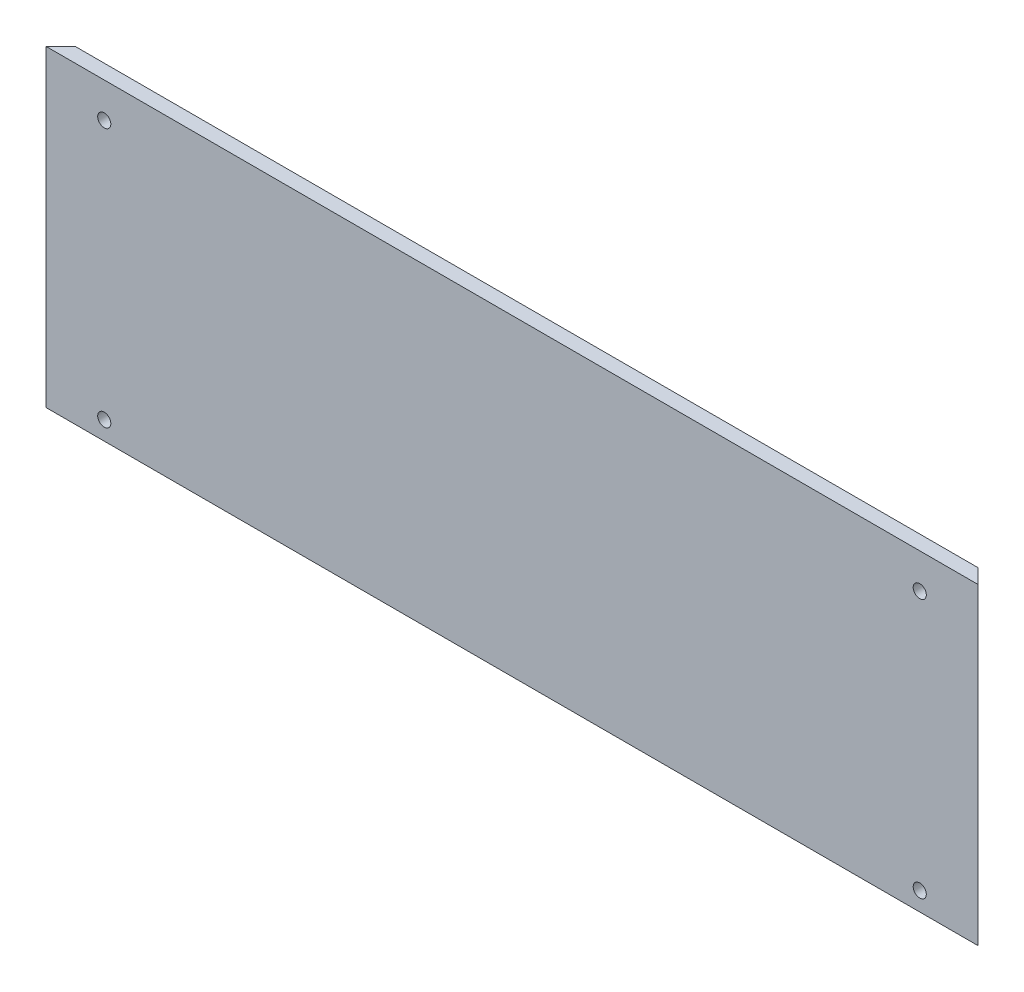
ISO-10303-21;
HEADER;
FILE_DESCRIPTION(('STEP AP214'),'2;1');
FILE_NAME('part.step','',(''),(''),'','','');
FILE_SCHEMA(('AUTOMOTIVE_DESIGN { 1 0 10303 214 1 1 1 1 }'));
ENDSEC;
DATA;
#1=APPLICATION_CONTEXT('core data for automotive mechanical design processes');
#2=APPLICATION_PROTOCOL_DEFINITION('international standard','automotive_design',2000,#1);
#3=PRODUCT_CONTEXT('',#1,'mechanical');
#4=PRODUCT('Part','Part','',(#3));
#5=PRODUCT_RELATED_PRODUCT_CATEGORY('part','',(#4));
#6=PRODUCT_DEFINITION_FORMATION('','',#4);
#7=PRODUCT_DEFINITION_CONTEXT('part definition',#1,'design');
#8=PRODUCT_DEFINITION('design','',#6,#7);
#9=PRODUCT_DEFINITION_SHAPE('','',#8);
#10=(LENGTH_UNIT() NAMED_UNIT(*) SI_UNIT(.MILLI.,.METRE.));
#11=(NAMED_UNIT(*) PLANE_ANGLE_UNIT() SI_UNIT($,.RADIAN.));
#12=(NAMED_UNIT(*) SI_UNIT($,.STERADIAN.) SOLID_ANGLE_UNIT());
#13=UNCERTAINTY_MEASURE_WITH_UNIT(LENGTH_MEASURE(1.E-05),#10,'distance_accuracy_value','');
#14=(GEOMETRIC_REPRESENTATION_CONTEXT(3) GLOBAL_UNCERTAINTY_ASSIGNED_CONTEXT((#13)) GLOBAL_UNIT_ASSIGNED_CONTEXT((#10,
#11,#12)) REPRESENTATION_CONTEXT('',''));
#15=CARTESIAN_POINT('',(0.,0.,0.));
#16=DIRECTION('',(0.,0.,1.));
#17=DIRECTION('',(1.,0.,0.));
#18=AXIS2_PLACEMENT_3D('',#15,#16,#17);
#19=CARTESIAN_POINT('',(0.,110.,-5.));
#20=DIRECTION('',(0.,1.,0.));
#21=DIRECTION('',(0.,0.,1.));
#22=AXIS2_PLACEMENT_3D('',#19,#20,#21);
#23=PLANE('',#22);
#24=DIRECTION('',(-0.707106781186544,0.,-0.707106781186551));
#25=VECTOR('',#24,1.);
#26=CARTESIAN_POINT('',(157.500000000002,110.,-162.5));
#27=LINE('',#26,#25);
#28=CARTESIAN_POINT('',(320.,110.,0.));
#29=VERTEX_POINT('',#28);
#30=CARTESIAN_POINT('',(315.,110.,-5.00000000000003));
#31=VERTEX_POINT('',#30);
#32=EDGE_CURVE('E129',#29,#31,#27,.T.);
#33=ORIENTED_EDGE('',*,*,#32,.T.);
#34=DIRECTION('',(-1.,0.,0.));
#35=VECTOR('',#34,1.);
#36=CARTESIAN_POINT('',(8.00000000000006,110.,-5.));
#37=LINE('',#36,#35);
#38=CARTESIAN_POINT('',(5.00000000000006,110.,-5.));
#39=VERTEX_POINT('',#38);
#40=EDGE_CURVE('E65',#31,#39,#37,.T.);
#41=ORIENTED_EDGE('',*,*,#40,.T.);
#42=DIRECTION('',(-0.707106781186548,0.,0.707106781186548));
#43=VECTOR('',#42,1.);
#44=CARTESIAN_POINT('',(2.50000000000003,110.,-2.49999999999997));
#45=LINE('',#44,#43);
#46=CARTESIAN_POINT('',(0.,110.,0.));
#47=VERTEX_POINT('',#46);
#48=EDGE_CURVE('E124',#39,#47,#45,.T.);
#49=ORIENTED_EDGE('',*,*,#48,.T.);
#50=DIRECTION('',(-1.,0.,0.));
#51=VECTOR('',#50,1.);
#52=CARTESIAN_POINT('',(0.,110.,0.));
#53=LINE('',#52,#51);
#54=EDGE_CURVE('E165',#29,#47,#53,.T.);
#55=ORIENTED_EDGE('',*,*,#54,.F.);
#56=EDGE_LOOP('',(#33,#41,#49,#55));
#57=FACE_BOUND('',#56,.T.);
#58=ADVANCED_FACE('F41',(#57),#23,.T.);
#59=CARTESIAN_POINT('',(0.,0.,-5.));
#60=DIRECTION('',(0.,0.,-1.));
#61=DIRECTION('',(-1.,0.,0.));
#62=AXIS2_PLACEMENT_3D('',#59,#60,#61);
#63=PLANE('',#62);
#64=DIRECTION('',(1.,0.,0.));
#65=VECTOR('',#64,1.);
#66=CARTESIAN_POINT('',(-5.,2.59999999999994,-5.00000000000028));
#67=LINE('',#66,#65);
#68=CARTESIAN_POINT('',(5.00000000000034,2.59999999999994,-5.00000000000028));
#69=VERTEX_POINT('',#68);
#70=CARTESIAN_POINT('',(315.,2.59999999999994,-5.00000000000028));
#71=VERTEX_POINT('',#70);
#72=EDGE_CURVE('E100',#69,#71,#67,.T.);
#73=ORIENTED_EDGE('',*,*,#72,.F.);
#74=DIRECTION('',(0.,1.,0.));
#75=VECTOR('',#74,1.);
#76=CARTESIAN_POINT('',(5.00000000000006,0.,-5.));
#77=LINE('',#76,#75);
#78=CARTESIAN_POINT('',(5.00000000000006,5.,-5.));
#79=VERTEX_POINT('',#78);
#80=EDGE_CURVE('E125',#69,#79,#77,.T.);
#81=ORIENTED_EDGE('',*,*,#80,.T.);
#82=DIRECTION('',(-1.,0.,0.));
#83=VECTOR('',#82,1.);
#84=CARTESIAN_POINT('',(0.,5.,-5.));
#85=LINE('',#84,#83);
#86=CARTESIAN_POINT('',(315.,4.99999999999994,-5.));
#87=VERTEX_POINT('',#86);
#88=EDGE_CURVE('E122',#87,#79,#85,.T.);
#89=ORIENTED_EDGE('',*,*,#88,.F.);
#90=DIRECTION('',(0.,-1.,0.));
#91=VECTOR('',#90,1.);
#92=CARTESIAN_POINT('',(315.,0.,-5.));
#93=LINE('',#92,#91);
#94=EDGE_CURVE('E114',#87,#71,#93,.T.);
#95=ORIENTED_EDGE('',*,*,#94,.T.);
#96=EDGE_LOOP('',(#73,#81,#89,#95));
#97=FACE_BOUND('',#96,.T.);
#98=ADVANCED_FACE('F120',(#97),#63,.T.);
#99=CARTESIAN_POINT('',(0.,0.,0.));
#100=DIRECTION('',(0.,0.,-1.));
#101=DIRECTION('',(-1.,0.,0.));
#102=AXIS2_PLACEMENT_3D('',#99,#100,#101);
#103=PLANE('',#102);
#104=CARTESIAN_POINT('',(300.,98.,0.));
#105=DIRECTION('',(0.,0.,1.));
#106=DIRECTION('',(-1.,0.,0.));
#107=AXIS2_PLACEMENT_3D('',#104,#105,#106);
#108=CIRCLE('',#107,2.25000000000001);
#109=CARTESIAN_POINT('',(297.75,98.,0.));
#110=VERTEX_POINT('',#109);
#111=EDGE_CURVE('E186',#110,#110,#108,.T.);
#112=ORIENTED_EDGE('',*,*,#111,.F.);
#113=EDGE_LOOP('',(#112));
#114=FACE_BOUND('',#113,.T.);
#115=CARTESIAN_POINT('',(20.,98.,0.));
#116=DIRECTION('',(0.,0.,1.));
#117=DIRECTION('',(1.,0.,0.));
#118=AXIS2_PLACEMENT_3D('',#115,#116,#117);
#119=CIRCLE('',#118,2.25);
#120=CARTESIAN_POINT('',(22.25,98.,0.));
#121=VERTEX_POINT('',#120);
#122=EDGE_CURVE('E191',#121,#121,#119,.T.);
#123=ORIENTED_EDGE('',*,*,#122,.F.);
#124=EDGE_LOOP('',(#123));
#125=FACE_BOUND('',#124,.T.);
#126=CARTESIAN_POINT('',(300.,9.,0.));
#127=DIRECTION('',(0.,0.,1.));
#128=DIRECTION('',(-1.,0.,0.));
#129=AXIS2_PLACEMENT_3D('',#126,#127,#128);
#130=CIRCLE('',#129,2.25000000000001);
#131=CARTESIAN_POINT('',(297.75,9.,0.));
#132=VERTEX_POINT('',#131);
#133=EDGE_CURVE('E201',#132,#132,#130,.T.);
#134=ORIENTED_EDGE('',*,*,#133,.F.);
#135=EDGE_LOOP('',(#134));
#136=FACE_BOUND('',#135,.T.);
#137=CARTESIAN_POINT('',(20.,9.,0.));
#138=DIRECTION('',(0.,0.,1.));
#139=DIRECTION('',(1.,0.,0.));
#140=AXIS2_PLACEMENT_3D('',#137,#138,#139);
#141=CIRCLE('',#140,2.25);
#142=CARTESIAN_POINT('',(22.25,9.,0.));
#143=VERTEX_POINT('',#142);
#144=EDGE_CURVE('E205',#143,#143,#141,.T.);
#145=ORIENTED_EDGE('',*,*,#144,.F.);
#146=EDGE_LOOP('',(#145));
#147=FACE_BOUND('',#146,.T.);
#148=DIRECTION('',(0.,-1.,0.));
#149=VECTOR('',#148,1.);
#150=CARTESIAN_POINT('',(0.,0.,0.));
#151=LINE('',#150,#149);
#152=CARTESIAN_POINT('',(0.,2.59999999999994,0.));
#153=VERTEX_POINT('',#152);
#154=EDGE_CURVE('E174',#47,#153,#151,.T.);
#155=ORIENTED_EDGE('',*,*,#154,.T.);
#156=DIRECTION('',(1.,0.,0.));
#157=VECTOR('',#156,1.);
#158=CARTESIAN_POINT('',(0.,2.59999999999994,-2.77555756156289E-13));
#159=LINE('',#158,#157);
#160=CARTESIAN_POINT('',(320.,2.59999999999994,-2.77555756156289E-13));
#161=VERTEX_POINT('',#160);
#162=EDGE_CURVE('E57',#153,#161,#159,.T.);
#163=ORIENTED_EDGE('',*,*,#162,.T.);
#164=DIRECTION('',(0.,1.,0.));
#165=VECTOR('',#164,1.);
#166=CARTESIAN_POINT('',(320.,0.,0.));
#167=LINE('',#166,#165);
#168=EDGE_CURVE('E116',#161,#29,#167,.T.);
#169=ORIENTED_EDGE('',*,*,#168,.T.);
#170=ORIENTED_EDGE('',*,*,#54,.T.);
#171=EDGE_LOOP('',(#155,#163,#169,#170));
#172=FACE_BOUND('',#171,.T.);
#173=ADVANCED_FACE('F209',(#114,#125,#136,#147,#172),#103,.F.);
#174=CARTESIAN_POINT('',(20.,9.,-5.));
#175=DIRECTION('',(0.,0.,1.));
#176=DIRECTION('',(1.,0.,0.));
#177=AXIS2_PLACEMENT_3D('',#174,#175,#176);
#178=CYLINDRICAL_SURFACE('',#177,2.25);
#179=ORIENTED_EDGE('',*,*,#144,.T.);
#180=EDGE_LOOP('',(#179));
#181=FACE_BOUND('',#180,.T.);
#182=CARTESIAN_POINT('',(20.,9.,-8.));
#183=DIRECTION('',(0.,0.,-1.));
#184=DIRECTION('',(-1.,0.,0.));
#185=AXIS2_PLACEMENT_3D('',#182,#183,#184);
#186=CIRCLE('',#185,2.25);
#187=CARTESIAN_POINT('',(17.75,9.,-8.));
#188=VERTEX_POINT('',#187);
#189=EDGE_CURVE('E220',#188,#188,#186,.T.);
#190=ORIENTED_EDGE('',*,*,#189,.T.);
#191=EDGE_LOOP('',(#190));
#192=FACE_BOUND('',#191,.T.);
#193=ADVANCED_FACE('F314',(#181,#192),#178,.F.);
#194=CARTESIAN_POINT('',(300.,9.,-5.));
#195=DIRECTION('',(0.,0.,1.));
#196=DIRECTION('',(1.,0.,0.));
#197=AXIS2_PLACEMENT_3D('',#194,#195,#196);
#198=CYLINDRICAL_SURFACE('',#197,2.25000000000001);
#199=ORIENTED_EDGE('',*,*,#133,.T.);
#200=EDGE_LOOP('',(#199));
#201=FACE_BOUND('',#200,.T.);
#202=CARTESIAN_POINT('',(300.,9.,-8.));
#203=DIRECTION('',(0.,0.,-1.));
#204=DIRECTION('',(-1.,0.,0.));
#205=AXIS2_PLACEMENT_3D('',#202,#203,#204);
#206=CIRCLE('',#205,2.25000000000001);
#207=CARTESIAN_POINT('',(297.75,9.,-8.));
#208=VERTEX_POINT('',#207);
#209=EDGE_CURVE('E215',#208,#208,#206,.T.);
#210=ORIENTED_EDGE('',*,*,#209,.T.);
#211=EDGE_LOOP('',(#210));
#212=FACE_BOUND('',#211,.T.);
#213=ADVANCED_FACE('F245',(#201,#212),#198,.F.);
#214=CARTESIAN_POINT('',(20.,98.,-5.));
#215=DIRECTION('',(0.,0.,1.));
#216=DIRECTION('',(1.,0.,0.));
#217=AXIS2_PLACEMENT_3D('',#214,#215,#216);
#218=CYLINDRICAL_SURFACE('',#217,2.25);
#219=ORIENTED_EDGE('',*,*,#122,.T.);
#220=EDGE_LOOP('',(#219));
#221=FACE_BOUND('',#220,.T.);
#222=CARTESIAN_POINT('',(20.,98.,-8.));
#223=DIRECTION('',(0.,0.,-1.));
#224=DIRECTION('',(-1.,0.,0.));
#225=AXIS2_PLACEMENT_3D('',#222,#223,#224);
#226=CIRCLE('',#225,2.25000000000001);
#227=CARTESIAN_POINT('',(17.75,98.,-8.));
#228=VERTEX_POINT('',#227);
#229=EDGE_CURVE('E193',#228,#228,#226,.T.);
#230=ORIENTED_EDGE('',*,*,#229,.T.);
#231=EDGE_LOOP('',(#230));
#232=FACE_BOUND('',#231,.T.);
#233=ADVANCED_FACE('F229',(#221,#232),#218,.F.);
#234=CARTESIAN_POINT('',(300.,98.,-5.));
#235=DIRECTION('',(0.,0.,1.));
#236=DIRECTION('',(1.,0.,0.));
#237=AXIS2_PLACEMENT_3D('',#234,#235,#236);
#238=CYLINDRICAL_SURFACE('',#237,2.25000000000001);
#239=ORIENTED_EDGE('',*,*,#111,.T.);
#240=EDGE_LOOP('',(#239));
#241=FACE_BOUND('',#240,.T.);
#242=CARTESIAN_POINT('',(300.,98.,-8.));
#243=DIRECTION('',(0.,0.,-1.));
#244=DIRECTION('',(-1.,0.,0.));
#245=AXIS2_PLACEMENT_3D('',#242,#243,#244);
#246=CIRCLE('',#245,2.25000000000001);
#247=CARTESIAN_POINT('',(297.75,98.,-8.));
#248=VERTEX_POINT('',#247);
#249=EDGE_CURVE('E211',#248,#248,#246,.T.);
#250=ORIENTED_EDGE('',*,*,#249,.T.);
#251=EDGE_LOOP('',(#250));
#252=FACE_BOUND('',#251,.T.);
#253=ADVANCED_FACE('F232',(#241,#252),#238,.F.);
#254=CARTESIAN_POINT('',(0.,0.,-8.));
#255=DIRECTION('',(0.,0.,1.));
#256=DIRECTION('',(1.,0.,0.));
#257=AXIS2_PLACEMENT_3D('',#254,#255,#256);
#258=PLANE('',#257);
#259=DIRECTION('',(0.,1.,0.));
#260=VECTOR('',#259,1.);
#261=CARTESIAN_POINT('',(8.00000000000006,110.,-8.));
#262=LINE('',#261,#260);
#263=CARTESIAN_POINT('',(8.00000000000006,5.,-8.));
#264=VERTEX_POINT('',#263);
#265=CARTESIAN_POINT('',(8.00000000000006,107.,-8.));
#266=VERTEX_POINT('',#265);
#267=EDGE_CURVE('E152',#264,#266,#262,.T.);
#268=ORIENTED_EDGE('',*,*,#267,.T.);
#269=DIRECTION('',(1.,0.,0.));
#270=VECTOR('',#269,1.);
#271=CARTESIAN_POINT('',(312.,107.,-8.));
#272=LINE('',#271,#270);
#273=CARTESIAN_POINT('',(312.,107.,-8.));
#274=VERTEX_POINT('',#273);
#275=EDGE_CURVE('E137',#266,#274,#272,.T.);
#276=ORIENTED_EDGE('',*,*,#275,.T.);
#277=DIRECTION('',(0.,-1.,0.));
#278=VECTOR('',#277,1.);
#279=CARTESIAN_POINT('',(312.,4.99999999999994,-8.));
#280=LINE('',#279,#278);
#281=CARTESIAN_POINT('',(312.,4.99999999999994,-8.));
#282=VERTEX_POINT('',#281);
#283=EDGE_CURVE('E164',#274,#282,#280,.T.);
#284=ORIENTED_EDGE('',*,*,#283,.T.);
#285=DIRECTION('',(-1.,0.,0.));
#286=VECTOR('',#285,1.);
#287=CARTESIAN_POINT('',(0.,5.,-8.));
#288=LINE('',#287,#286);
#289=EDGE_CURVE('E162',#282,#264,#288,.T.);
#290=ORIENTED_EDGE('',*,*,#289,.T.);
#291=EDGE_LOOP('',(#268,#276,#284,#290));
#292=FACE_BOUND('',#291,.T.);
#293=ORIENTED_EDGE('',*,*,#229,.F.);
#294=EDGE_LOOP('',(#293));
#295=FACE_BOUND('',#294,.T.);
#296=ORIENTED_EDGE('',*,*,#189,.F.);
#297=EDGE_LOOP('',(#296));
#298=FACE_BOUND('',#297,.T.);
#299=ORIENTED_EDGE('',*,*,#209,.F.);
#300=EDGE_LOOP('',(#299));
#301=FACE_BOUND('',#300,.T.);
#302=ORIENTED_EDGE('',*,*,#249,.F.);
#303=EDGE_LOOP('',(#302));
#304=FACE_BOUND('',#303,.T.);
#305=ADVANCED_FACE('F158',(#292,#295,#298,#301,#304),#258,.F.);
#306=CARTESIAN_POINT('',(0.,5.,-8.));
#307=DIRECTION('',(0.,1.,0.));
#308=DIRECTION('',(-1.,0.,0.));
#309=AXIS2_PLACEMENT_3D('',#306,#307,#308);
#310=PLANE('',#309);
#311=ORIENTED_EDGE('',*,*,#289,.F.);
#312=DIRECTION('',(0.707106781186544,0.,0.707106781186551));
#313=VECTOR('',#312,1.);
#314=CARTESIAN_POINT('',(312.,4.99999999999994,-8.));
#315=LINE('',#314,#313);
#316=EDGE_CURVE('E131',#282,#87,#315,.T.);
#317=ORIENTED_EDGE('',*,*,#316,.T.);
#318=ORIENTED_EDGE('',*,*,#88,.T.);
#319=DIRECTION('',(0.707106781186548,0.,-0.707106781186548));
#320=VECTOR('',#319,1.);
#321=CARTESIAN_POINT('',(8.00000000000006,5.,-8.));
#322=LINE('',#321,#320);
#323=EDGE_CURVE('E180',#79,#264,#322,.T.);
#324=ORIENTED_EDGE('',*,*,#323,.T.);
#325=EDGE_LOOP('',(#311,#317,#318,#324));
#326=FACE_BOUND('',#325,.T.);
#327=ADVANCED_FACE('F184',(#326),#310,.F.);
#328=CARTESIAN_POINT('',(312.,0.,-8.));
#329=DIRECTION('',(0.707106781186551,0.,-0.707106781186544));
#330=DIRECTION('',(0.,1.,0.));
#331=AXIS2_PLACEMENT_3D('',#328,#329,#330);
#332=PLANE('',#331);
#333=DIRECTION('',(0.707106781186547,0.,0.707106781186547));
#334=VECTOR('',#333,1.);
#335=CARTESIAN_POINT('',(320.,2.59999999999994,-2.77555756156289E-13));
#336=LINE('',#335,#334);
#337=EDGE_CURVE('E103',#71,#161,#336,.T.);
#338=ORIENTED_EDGE('',*,*,#337,.F.);
#339=ORIENTED_EDGE('',*,*,#94,.F.);
#340=ORIENTED_EDGE('',*,*,#316,.F.);
#341=ORIENTED_EDGE('',*,*,#283,.F.);
#342=DIRECTION('',(0.577350269189622,0.577350269189628,0.577350269189628));
#343=VECTOR('',#342,1.);
#344=CARTESIAN_POINT('',(276.333333333334,71.333333333333,-43.6666666666669));
#345=LINE('',#344,#343);
#346=EDGE_CURVE('E141',#274,#31,#345,.T.);
#347=ORIENTED_EDGE('',*,*,#346,.T.);
#348=ORIENTED_EDGE('',*,*,#32,.F.);
#349=ORIENTED_EDGE('',*,*,#168,.F.);
#350=EDGE_LOOP('',(#338,#339,#340,#341,#347,#348,#349));
#351=FACE_BOUND('',#350,.T.);
#352=ADVANCED_FACE('F112',(#351),#332,.T.);
#353=CARTESIAN_POINT('',(8.00000000000006,0.,-8.));
#354=DIRECTION('',(-0.707106781186547,0.,-0.707106781186547));
#355=DIRECTION('',(0.,-1.,0.));
#356=AXIS2_PLACEMENT_3D('',#353,#354,#355);
#357=PLANE('',#356);
#358=DIRECTION('',(0.707106781186548,0.,-0.707106781186548));
#359=VECTOR('',#358,1.);
#360=CARTESIAN_POINT('',(8.00000000000006,2.59999999999994,-8.));
#361=LINE('',#360,#359);
#362=EDGE_CURVE('E11',#153,#69,#361,.T.);
#363=ORIENTED_EDGE('',*,*,#362,.F.);
#364=ORIENTED_EDGE('',*,*,#154,.F.);
#365=ORIENTED_EDGE('',*,*,#48,.F.);
#366=DIRECTION('',(0.577350269189626,-0.577350269189626,-0.577350269189626));
#367=VECTOR('',#366,1.);
#368=CARTESIAN_POINT('',(43.6666666666667,71.3333333333333,-43.6666666666667));
#369=LINE('',#368,#367);
#370=EDGE_CURVE('E51',#39,#266,#369,.T.);
#371=ORIENTED_EDGE('',*,*,#370,.T.);
#372=ORIENTED_EDGE('',*,*,#267,.F.);
#373=ORIENTED_EDGE('',*,*,#323,.F.);
#374=ORIENTED_EDGE('',*,*,#80,.F.);
#375=EDGE_LOOP('',(#363,#364,#365,#371,#372,#373,#374));
#376=FACE_BOUND('',#375,.T.);
#377=ADVANCED_FACE('F150',(#376),#357,.T.);
#378=CARTESIAN_POINT('',(0.,107.,-8.));
#379=DIRECTION('',(0.,0.707106781186547,-0.707106781186548));
#380=DIRECTION('',(-1.,0.,0.));
#381=AXIS2_PLACEMENT_3D('',#378,#379,#380);
#382=PLANE('',#381);
#383=ORIENTED_EDGE('',*,*,#370,.F.);
#384=ORIENTED_EDGE('',*,*,#40,.F.);
#385=ORIENTED_EDGE('',*,*,#346,.F.);
#386=ORIENTED_EDGE('',*,*,#275,.F.);
#387=EDGE_LOOP('',(#383,#384,#385,#386));
#388=FACE_BOUND('',#387,.T.);
#389=ADVANCED_FACE('F44',(#388),#382,.T.);
#390=CARTESIAN_POINT('',(0.,2.59999999999994,-2.77555756156289E-13));
#391=DIRECTION('',(0.,1.,0.));
#392=DIRECTION('',(0.,0.,1.));
#393=AXIS2_PLACEMENT_3D('',#390,#391,#392);
#394=PLANE('',#393);
#395=ORIENTED_EDGE('',*,*,#362,.T.);
#396=ORIENTED_EDGE('',*,*,#72,.T.);
#397=ORIENTED_EDGE('',*,*,#337,.T.);
#398=ORIENTED_EDGE('',*,*,#162,.F.);
#399=EDGE_LOOP('',(#395,#396,#397,#398));
#400=FACE_BOUND('',#399,.T.);
#401=ADVANCED_FACE('F102',(#400),#394,.F.);
#402=CLOSED_SHELL('',(#58,#98,#173,#193,#213,#233,#253,#305,#327,#352,#377,#389,#401));
#403=MANIFOLD_SOLID_BREP('B2',#402);
#404=ADVANCED_BREP_SHAPE_REPRESENTATION('',(#18,#403),#14);
#405=SHAPE_DEFINITION_REPRESENTATION(#9,#404);
ENDSEC;
END-ISO-10303-21;
